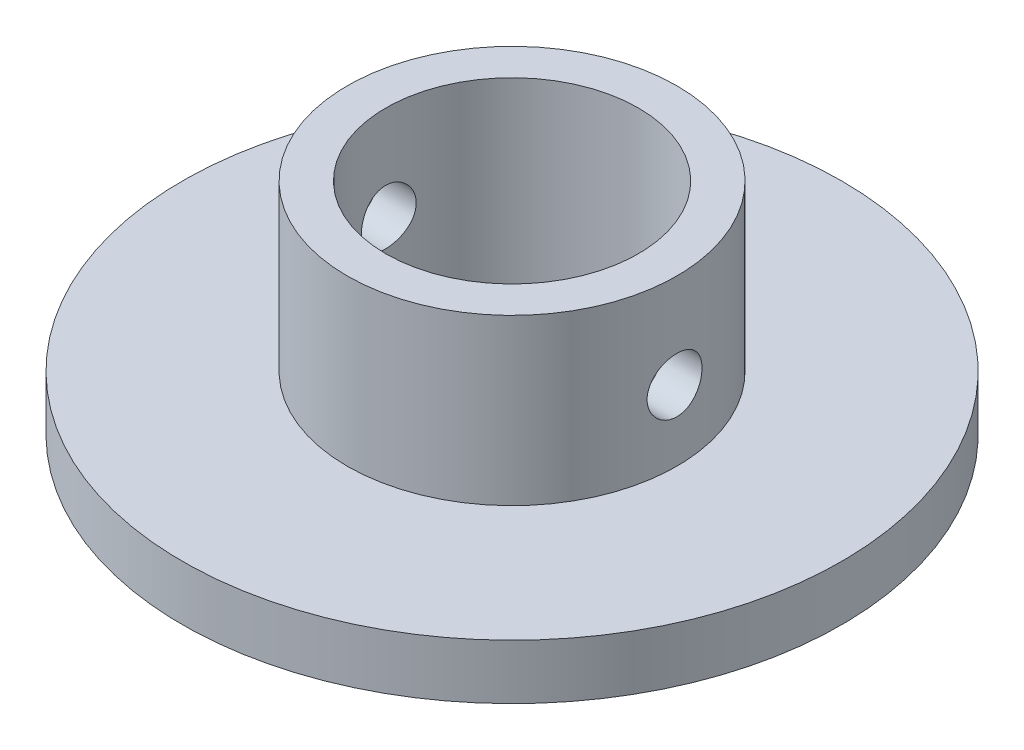
ISO-10303-21;
HEADER;
FILE_DESCRIPTION(('STEP AP214'),'2;1');
FILE_NAME('part.step','',(''),(''),'','','');
FILE_SCHEMA(('AUTOMOTIVE_DESIGN { 1 0 10303 214 1 1 1 1 }'));
ENDSEC;
DATA;
#1=APPLICATION_CONTEXT('core data for automotive mechanical design processes');
#2=APPLICATION_PROTOCOL_DEFINITION('international standard','automotive_design',2000,#1);
#3=PRODUCT_CONTEXT('',#1,'mechanical');
#4=PRODUCT('Part','Part','',(#3));
#5=PRODUCT_RELATED_PRODUCT_CATEGORY('part','',(#4));
#6=PRODUCT_DEFINITION_FORMATION('','',#4);
#7=PRODUCT_DEFINITION_CONTEXT('part definition',#1,'design');
#8=PRODUCT_DEFINITION('design','',#6,#7);
#9=PRODUCT_DEFINITION_SHAPE('','',#8);
#10=(LENGTH_UNIT() NAMED_UNIT(*) SI_UNIT(.MILLI.,.METRE.));
#11=(NAMED_UNIT(*) PLANE_ANGLE_UNIT() SI_UNIT($,.RADIAN.));
#12=(NAMED_UNIT(*) SI_UNIT($,.STERADIAN.) SOLID_ANGLE_UNIT());
#13=UNCERTAINTY_MEASURE_WITH_UNIT(LENGTH_MEASURE(1.E-05),#10,'distance_accuracy_value','');
#14=(GEOMETRIC_REPRESENTATION_CONTEXT(3) GLOBAL_UNCERTAINTY_ASSIGNED_CONTEXT((#13)) GLOBAL_UNIT_ASSIGNED_CONTEXT((#10,
#11,#12)) REPRESENTATION_CONTEXT('',''));
#15=CARTESIAN_POINT('',(0.,0.,0.));
#16=DIRECTION('',(0.,0.,1.));
#17=DIRECTION('',(1.,0.,0.));
#18=AXIS2_PLACEMENT_3D('',#15,#16,#17);
#19=CARTESIAN_POINT('',(-2.240463819,2.28,0.));
#20=DIRECTION('',(-1.,0.,0.));
#21=DIRECTION('',(0.,-1.,0.));
#22=AXIS2_PLACEMENT_3D('',#19,#20,#21);
#23=CYLINDRICAL_SURFACE('',#22,0.5);
#24=CARTESIAN_POINT('',(-2.95803989159308,2.28000000058204,0.500000000051196));
#25=CARTESIAN_POINT('',(-2.95804069507885,2.307856805182,0.499997887581498));
#26=CARTESIAN_POINT('',(-2.95843781465187,2.3357336896618,0.49766339055465));
#27=CARTESIAN_POINT('',(-2.95998356153414,2.39073428307943,0.488383475383723));
#28=CARTESIAN_POINT('',(-2.96113371597554,2.4178563444864,0.481428687005735));
#29=CARTESIAN_POINT('',(-2.96405142810723,2.47050168025128,0.463124651698856));
#30=CARTESIAN_POINT('',(-2.96581820613379,2.49602692579895,0.4517809521865));
#31=CARTESIAN_POINT('',(-2.96976910315052,2.54480225948373,0.425033335167014));
#32=CARTESIAN_POINT('',(-2.97195306733915,2.56805318670806,0.409630922888113));
#33=CARTESIAN_POINT('',(-2.97651688433684,2.61186198285905,0.375037951768843));
#34=CARTESIAN_POINT('',(-2.97889831174944,2.63239395897036,0.355814804728234));
#35=CARTESIAN_POINT('',(-2.98357484216161,2.66995778425966,0.31419556037142));
#36=CARTESIAN_POINT('',(-2.98586993556238,2.68698924517748,0.29179911155289));
#37=CARTESIAN_POINT('',(-2.99013148346955,2.71716297888047,0.244304469110437));
#38=CARTESIAN_POINT('',(-2.99209590196663,2.73028151544495,0.219190997402315));
#39=CARTESIAN_POINT('',(-2.99545748606508,2.75210429010311,0.167078889780056));
#40=CARTESIAN_POINT('',(-2.99685469345198,2.76080885337897,0.140080392904535));
#41=CARTESIAN_POINT('',(-2.99891346860788,2.77347850175433,0.0852287675154882));
#42=CARTESIAN_POINT('',(-2.99958170512892,2.77748657667637,0.0573858231972914));
#43=CARTESIAN_POINT('',(-3.00013015887605,2.78078315193157,0.00141510331579962));
#44=CARTESIAN_POINT('',(-3.00001042835627,2.78007196522308,-0.0267126532366269));
#45=CARTESIAN_POINT('',(-2.99900171889423,2.77398374229923,-0.082160324865193));
#46=CARTESIAN_POINT('',(-2.998120374546,2.76865301197167,-0.109485483141747));
#47=CARTESIAN_POINT('',(-2.99569597020577,2.75354986398974,-0.162848182602397));
#48=CARTESIAN_POINT('',(-2.99415288465514,2.74377727477528,-0.188885674009228));
#49=CARTESIAN_POINT('',(-2.99056532729767,2.72002141607699,-0.239072201547559));
#50=CARTESIAN_POINT('',(-2.9885185754237,2.70601893060872,-0.263211972124426));
#51=CARTESIAN_POINT('',(-2.98415129727813,2.67421604048092,-0.308814768686282));
#52=CARTESIAN_POINT('',(-2.98183076995704,2.65641562126216,-0.330277784409536));
#53=CARTESIAN_POINT('',(-2.97714105304146,2.61726863720083,-0.370189837180317));
#54=CARTESIAN_POINT('',(-2.97477161330008,2.59588224237293,-0.388599797307925));
#55=CARTESIAN_POINT('',(-2.9702768691655,2.55029303682724,-0.421584466963118));
#56=CARTESIAN_POINT('',(-2.96815167487368,2.52608896577142,-0.436157450643181));
#57=CARTESIAN_POINT('',(-2.96438554906937,2.47549671641633,-0.461061636009483));
#58=CARTESIAN_POINT('',(-2.96274555482401,2.44910443535074,-0.47138464282226));
#59=CARTESIAN_POINT('',(-2.96015056134997,2.39497021229259,-0.48741752826706));
#60=CARTESIAN_POINT('',(-2.95919411555658,2.36723125396264,-0.493137152101977));
#61=CARTESIAN_POINT('',(-2.95823880374551,2.31957334005354,-0.498825652147997));
#62=CARTESIAN_POINT('',(-2.95803932070178,2.29979173839721,-0.500001500823426));
#63=CARTESIAN_POINT('',(-2.95804069501651,2.25214319614594,-0.499997887596045));
#64=CARTESIAN_POINT('',(-2.95843781461349,2.22426631166143,-0.497663390686697));
#65=CARTESIAN_POINT('',(-2.95998356149858,2.16926571822704,-0.488383475695662));
#66=CARTESIAN_POINT('',(-2.96113371591869,2.14214365680794,-0.481428687380342));
#67=CARTESIAN_POINT('',(-2.9640514280229,2.08949832100205,-0.463124652209911));
#68=CARTESIAN_POINT('',(-2.96581820604334,2.06397307542571,-0.451780952770772));
#69=CARTESIAN_POINT('',(-2.96976910304825,2.01519774167049,-0.425033335887275));
#70=CARTESIAN_POINT('',(-2.97195306723123,1.99194681440458,-0.409630923670809));
#71=CARTESIAN_POINT('',(-2.97651688422245,1.94813801816155,-0.375037952671464));
#72=CARTESIAN_POINT('',(-2.97889831163429,1.92760604199951,-0.355814805688501));
#73=CARTESIAN_POINT('',(-2.98357484204891,1.89004221660052,-0.3141955614388));
#74=CARTESIAN_POINT('',(-2.98586993545289,1.8730107556236,-0.291799112669863));
#75=CARTESIAN_POINT('',(-2.99013148337088,1.842837021792,-0.244304470313722));
#76=CARTESIAN_POINT('',(-2.99209590187556,1.82971848515849,-0.219190998641915));
#77=CARTESIAN_POINT('',(-2.99545748599233,1.80789571035685,-0.167078891079758));
#78=CARTESIAN_POINT('',(-2.99685469338996,1.79919114700659,-0.140080394227996));
#79=CARTESIAN_POINT('',(-2.99891346856923,1.78652149847962,-0.0852287688708964));
#80=CARTESIAN_POINT('',(-2.99958170510282,1.78251342348076,-0.0573858245609197));
#81=CARTESIAN_POINT('',(-3.00013015887539,1.77921684807213,-0.00141510468260699));
#82=CARTESIAN_POINT('',(-3.0000104283685,1.779928034704,0.0267126518748589));
#83=CARTESIAN_POINT('',(-2.99900171893105,1.78601625747769,0.0821603235243223));
#84=CARTESIAN_POINT('',(-2.99812037459459,1.79134698773135,0.109485481816645));
#85=CARTESIAN_POINT('',(-2.99569597027563,1.80645013556942,0.162848181320672));
#86=CARTESIAN_POINT('',(-2.99415288473452,1.81622272471389,0.188885672755123));
#87=CARTESIAN_POINT('',(-2.99056532739314,1.83997858327606,0.239072200356543));
#88=CARTESIAN_POINT('',(-2.98851857552578,1.85398106867769,0.263211970969197));
#89=CARTESIAN_POINT('',(-2.98415129738941,1.88578395867904,0.308814767613738));
#90=CARTESIAN_POINT('',(-2.9818307700709,1.9035843778381,0.330277783383819));
#91=CARTESIAN_POINT('',(-2.97714105315644,1.94273136178826,0.370189836259329));
#92=CARTESIAN_POINT('',(-2.97477161341356,1.96411775656494,0.388599796444819));
#93=CARTESIAN_POINT('',(-2.97027686927076,2.00970696201643,0.421584466221142));
#94=CARTESIAN_POINT('',(-2.96815167497222,2.03391103302908,0.436157449964734));
#95=CARTESIAN_POINT('',(-2.96438554915481,2.08450328231153,0.461061635471456));
#96=CARTESIAN_POINT('',(-2.96274555490311,2.11089556334788,0.471384642360721));
#97=CARTESIAN_POINT('',(-2.96015056139773,2.16502978636375,0.487417527944937));
#98=CARTESIAN_POINT('',(-2.95919411557948,2.19276874468084,0.493137151842151));
#99=CARTESIAN_POINT('',(-2.958238803758,2.24042665947064,0.498825652160067));
#100=CARTESIAN_POINT('',(-2.95803932073147,2.26020826202865,0.500001500921398));
#101=CARTESIAN_POINT('',(-2.95803989159308,2.28000000058204,0.500000000051196));
#102=B_SPLINE_CURVE_WITH_KNOTS('',3,(#24,#25,#26,#27,#28,#29,#30,#31,#32,#33,#34,#35,#36,#37,
#38,#39,#40,#41,#42,#43,#44,#45,#46,#47,#48,#49,#50,#51,#52,#53,#54,#55,#56,#57,#58,#59,#60,#61,
#62,#63,#64,#65,#66,#67,#68,#69,#70,#71,#72,#73,#74,#75,#76,#77,#78,#79,#80,#81,#82,#83,#84,#85,
#86,#87,#88,#89,#90,#91,#92,#93,#94,#95,#96,#97,#98,#99,#100,#101),.UNSPECIFIED.,.T.,.F.,(4,2,2,
2,2,2,2,2,2,2,2,2,2,2,2,2,2,2,2,2,2,2,2,2,2,2,2,2,2,2,2,2,2,2,2,2,2,2,4),(0.,0.0835058152179128,
0.167181504466604,0.250751774535258,0.33429109495823,0.418576143657952,0.50287053580739,
0.587666327042206,0.672455870371298,0.756463065353911,0.840464689445984,0.923633902767314,
1.006806328647,1.09036243043716,1.17391885254209,1.25847365312448,1.34306642119494,
1.42782154695663,1.51239677359162,1.57172609047435,1.65523190567998,1.7389075949093,
1.82247786496903,1.9060171853901,1.990302234083,2.07459662622224,2.15939241745806,
2.24418196078943,2.32818915578128,2.41219077988235,2.49535999320644,2.5785324190882,
2.66208852086949,2.74564494296781,2.83019974354696,2.91479251160806,2.9995476373688,
3.08412286401508,3.14345218359121),.UNSPECIFIED.);
#103=CARTESIAN_POINT('',(-2.95803989159308,2.28000000058204,0.500000000051196));
#104=VERTEX_POINT('',#103);
#105=EDGE_CURVE('E58',#104,#104,#102,.T.);
#106=ORIENTED_EDGE('',*,*,#105,.T.);
#107=EDGE_LOOP('',(#106));
#108=FACE_BOUND('',#107,.T.);
#109=CARTESIAN_POINT('',(-2.24499443198505,2.27999999995898,-0.499999999901078));
#110=CARTESIAN_POINT('',(-2.24499535384733,2.25229292529622,-0.499998122074962));
#111=CARTESIAN_POINT('',(-2.24551313376967,2.22456966961218,-0.497688449759573));
#112=CARTESIAN_POINT('',(-2.24752673327762,2.16987899845851,-0.488512728170176));
#113=CARTESIAN_POINT('',(-2.24902446512596,2.14291316854075,-0.481637769877275));
#114=CARTESIAN_POINT('',(-2.25282014468306,2.09058278628752,-0.463558035764063));
#115=CARTESIAN_POINT('',(-2.25511683954123,2.06521579994516,-0.452360035887732));
#116=CARTESIAN_POINT('',(-2.260250072117,2.01672735585838,-0.425968862428391));
#117=CARTESIAN_POINT('',(-2.26308644711179,1.99360522441743,-0.410776892570007));
#118=CARTESIAN_POINT('',(-2.26903314487576,1.94986568156982,-0.376555341819291));
#119=CARTESIAN_POINT('',(-2.27214695783686,1.92929136865721,-0.357471271494804));
#120=CARTESIAN_POINT('',(-2.27826724915239,1.89160819503957,-0.316123966821642));
#121=CARTESIAN_POINT('',(-2.28127371341154,1.87449978805275,-0.293860316887014));
#122=CARTESIAN_POINT('',(-2.28687800575031,1.84406681111796,-0.246500592602825));
#123=CARTESIAN_POINT('',(-2.28947127908026,1.83078326562461,-0.221377570953132));
#124=CARTESIAN_POINT('',(-2.29391794059636,1.8086425989987,-0.169190299374774));
#125=CARTESIAN_POINT('',(-2.29577141688059,1.79978495078034,-0.142126281041101));
#126=CARTESIAN_POINT('',(-2.29850520118494,1.7868817844844,-0.0872697721177148));
#127=CARTESIAN_POINT('',(-2.29940013220665,1.78276388477565,-0.0594950479268212));
#128=CARTESIAN_POINT('',(-2.30016664455472,1.77923083776547,-0.00363550097204536));
#129=CARTESIAN_POINT('',(-2.30003834008788,1.77981516563252,0.0244492868351708));
#130=CARTESIAN_POINT('',(-2.29878402664363,1.78561599576177,0.0796326060873317));
#131=CARTESIAN_POINT('',(-2.29767482955103,1.79075444648173,0.106739780588338));
#132=CARTESIAN_POINT('',(-2.29460249194418,1.80539338777341,0.159697834251257));
#133=CARTESIAN_POINT('',(-2.29263930699969,1.81489410530128,0.185548647970951));
#134=CARTESIAN_POINT('',(-2.28805242610853,1.83805752089455,0.235477822361932));
#135=CARTESIAN_POINT('',(-2.28542402748968,1.85175000318007,0.25954191565146));
#136=CARTESIAN_POINT('',(-2.27979528865967,1.88288498417118,0.305057584807457));
#137=CARTESIAN_POINT('',(-2.27679492480684,1.90032772129031,0.326508994442888));
#138=CARTESIAN_POINT('',(-2.2706798439482,1.93889014194787,0.366652908743001));
#139=CARTESIAN_POINT('',(-2.2675640426186,1.96007752032038,0.385280273025199));
#140=CARTESIAN_POINT('',(-2.26162524737695,2.00531704438913,0.418737373770917));
#141=CARTESIAN_POINT('',(-2.25880238365863,2.02937045375376,0.433565425925742));
#142=CARTESIAN_POINT('',(-2.25376571167947,2.07977389307906,0.45903145514923));
#143=CARTESIAN_POINT('',(-2.25155417826524,2.10613203302417,0.469653844056162));
#144=CARTESIAN_POINT('',(-2.24802319536502,2.16027549178432,0.486276836990657));
#145=CARTESIAN_POINT('',(-2.24670186698705,2.18805767067651,0.492287179087443));
#146=CARTESIAN_POINT('',(-2.24529987814342,2.23731136809398,0.498632719789108));
#147=CARTESIAN_POINT('',(-2.24499372173583,2.25865088058231,0.500001446910087));
#148=CARTESIAN_POINT('',(-2.24499535393512,2.30770707465454,0.499998122187395));
#149=CARTESIAN_POINT('',(-2.24551313379201,2.33543033033233,0.497688449795089));
#150=CARTESIAN_POINT('',(-2.24752673325107,2.39012100148426,0.488512728153526));
#151=CARTESIAN_POINT('',(-2.24902446511635,2.41708683140633,0.481637769884527));
#152=CARTESIAN_POINT('',(-2.2528201446856,2.46941721366801,0.463558035790438));
#153=CARTESIAN_POINT('',(-2.25511683953903,2.49478420001447,0.452360035909264));
#154=CARTESIAN_POINT('',(-2.26025007211108,2.54327264410535,0.425968862448574));
#155=CARTESIAN_POINT('',(-2.26308644710679,2.56639477554671,0.410776892594352));
#156=CARTESIAN_POINT('',(-2.26903314487118,2.61013431839553,0.376555341850176));
#157=CARTESIAN_POINT('',(-2.27214695783175,2.63070863130896,0.35747127152805));
#158=CARTESIAN_POINT('',(-2.27826724914712,2.66839180493036,0.316123966858502));
#159=CARTESIAN_POINT('',(-2.28127371340661,2.68550021191984,0.293860316924881));
#160=CARTESIAN_POINT('',(-2.28687800574607,2.71593318885966,0.246500592642484));
#161=CARTESIAN_POINT('',(-2.28947127907635,2.72921673435547,0.221377570993616));
#162=CARTESIAN_POINT('',(-2.2939179405932,2.75135740098604,0.169190299417216));
#163=CARTESIAN_POINT('',(-2.29577141687788,2.76021504920673,0.142126281084729));
#164=CARTESIAN_POINT('',(-2.29850520118322,2.77311821550762,0.0872697721628245));
#165=CARTESIAN_POINT('',(-2.29940013220547,2.77723611521893,0.0594950479722153));
#166=CARTESIAN_POINT('',(-2.30016664455465,2.78076916223421,0.00363550101743227));
#167=CARTESIAN_POINT('',(-2.30003834008837,2.7801848343697,-0.0244492867900768));
#168=CARTESIAN_POINT('',(-2.29878402664517,2.77438400424538,-0.0796326060428936));
#169=CARTESIAN_POINT('',(-2.29767482955308,2.76924555352788,-0.106739780544262));
#170=CARTESIAN_POINT('',(-2.29460249194716,2.75460661224094,-0.159697834208651));
#171=CARTESIAN_POINT('',(-2.29263930700307,2.74510589471531,-0.185548647929437));
#172=CARTESIAN_POINT('',(-2.28805242611253,2.72194247912616,-0.235477822323103));
#173=CARTESIAN_POINT('',(-2.28542402749389,2.70824999684251,-0.25954191561421));
#174=CARTESIAN_POINT('',(-2.27979528866437,2.67711501585545,-0.305057584772783));
#175=CARTESIAN_POINT('',(-2.27679492481184,2.65967227873866,-0.326508994409323));
#176=CARTESIAN_POINT('',(-2.27067984395322,2.62110985808634,-0.366652908710855));
#177=CARTESIAN_POINT('',(-2.26756404262332,2.59992247971683,-0.385280272993463));
#178=CARTESIAN_POINT('',(-2.26162524738247,2.55468295565171,-0.418737373744926));
#179=CARTESIAN_POINT('',(-2.25880238366527,2.5306295462874,-0.43356542590468));
#180=CARTESIAN_POINT('',(-2.25376571168092,2.48022610696082,-0.459031455129345));
#181=CARTESIAN_POINT('',(-2.25155417826037,2.45386796701402,-0.469653844032322));
#182=CARTESIAN_POINT('',(-2.24802319537497,2.39972450825571,-0.486276836990454));
#183=CARTESIAN_POINT('',(-2.24670186701795,2.3719423293673,-0.492287179115549));
#184=CARTESIAN_POINT('',(-2.24529987812156,2.32268863192308,-0.498632719761482));
#185=CARTESIAN_POINT('',(-2.24499372166293,2.30134911940478,-0.500001446821568));
#186=CARTESIAN_POINT('',(-2.24499443198505,2.27999999995898,-0.499999999901078));
#187=B_SPLINE_CURVE_WITH_KNOTS('',3,(#109,#110,#111,#112,#113,#114,#115,#116,#117,#118,#119,
#120,#121,#122,#123,#124,#125,#126,#127,#128,#129,#130,#131,#132,#133,#134,#135,#136,#137,#138,
#139,#140,#141,#142,#143,#144,#145,#146,#147,#148,#149,#150,#151,#152,#153,#154,#155,#156,#157,
#158,#159,#160,#161,#162,#163,#164,#165,#166,#167,#168,#169,#170,#171,#172,#173,#174,#175,#176,
#177,#178,#179,#180,#181,#182,#183,#184,#185,#186),.UNSPECIFIED.,.T.,.F.,(4,2,2,2,2,2,2,2,2,2,2,
2,2,2,2,2,2,2,2,2,2,2,2,2,2,2,2,2,2,2,2,2,2,2,2,2,2,2,4),(0.,0.0830496828803049,
0.166261912890418,0.249344241983804,0.332401559916516,0.416713176746301,0.501035823602085,
0.58623180172581,0.671417631331125,0.75528455117382,0.839142110475678,0.921589671356532,
1.00404152223212,1.08709338743263,1.17015053402024,1.25490048072607,1.33968793397242,
1.42478677153193,1.50970542962325,1.57369766334073,1.65674734621028,1.73995957622876,
1.8230419053326,1.90609922326183,1.99041084008781,2.07473348694634,2.15992946507132,
2.24511529467556,2.32898221451857,2.41283977382113,2.49528733470163,2.57773918557785,
2.66079105077972,2.74384819736514,2.82859814406606,2.91338559731657,2.99848443488365,
3.08340309296795,3.14739532676844),.UNSPECIFIED.);
#188=CARTESIAN_POINT('',(-2.24499443198505,2.27999999995898,-0.499999999901078));
#189=VERTEX_POINT('',#188);
#190=EDGE_CURVE('E50',#189,#189,#187,.T.);
#191=ORIENTED_EDGE('',*,*,#190,.F.);
#192=EDGE_LOOP('',(#191));
#193=FACE_BOUND('',#192,.T.);
#194=ADVANCED_FACE('F14',(#108,#193),#23,.F.);
#195=CARTESIAN_POINT('',(0.,1.,0.));
#196=DIRECTION('',(0.,-1.,0.));
#197=DIRECTION('',(0.,0.,-1.));
#198=AXIS2_PLACEMENT_3D('',#195,#196,#197);
#199=CYLINDRICAL_SURFACE('',#198,6.);
#200=CARTESIAN_POINT('',(0.,1.,0.));
#201=DIRECTION('',(0.,-1.,0.));
#202=DIRECTION('',(0.,0.,-1.));
#203=AXIS2_PLACEMENT_3D('',#200,#201,#202);
#204=CIRCLE('',#203,6.);
#205=CARTESIAN_POINT('',(0.,1.,-6.));
#206=VERTEX_POINT('',#205);
#207=EDGE_CURVE('E18',#206,#206,#204,.F.);
#208=ORIENTED_EDGE('',*,*,#207,.F.);
#209=EDGE_LOOP('',(#208));
#210=FACE_BOUND('',#209,.T.);
#211=CARTESIAN_POINT('',(0.,0.,0.));
#212=DIRECTION('',(0.,-1.,0.));
#213=DIRECTION('',(0.,0.,-1.));
#214=AXIS2_PLACEMENT_3D('',#211,#212,#213);
#215=CIRCLE('',#214,6.);
#216=CARTESIAN_POINT('',(0.,0.,-6.));
#217=VERTEX_POINT('',#216);
#218=EDGE_CURVE('E57',#217,#217,#215,.F.);
#219=ORIENTED_EDGE('',*,*,#218,.T.);
#220=EDGE_LOOP('',(#219));
#221=FACE_BOUND('',#220,.T.);
#222=ADVANCED_FACE('F66',(#210,#221),#199,.T.);
#223=CARTESIAN_POINT('',(-6.072,1.,-6.072));
#224=DIRECTION('',(0.,1.,0.));
#225=DIRECTION('',(0.,0.,1.));
#226=AXIS2_PLACEMENT_3D('',#223,#224,#225);
#227=PLANE('',#226);
#228=CARTESIAN_POINT('',(0.,1.,0.));
#229=DIRECTION('',(0.,-1.,0.));
#230=DIRECTION('',(0.,0.,-1.));
#231=AXIS2_PLACEMENT_3D('',#228,#229,#230);
#232=CIRCLE('',#231,3.);
#233=CARTESIAN_POINT('',(0.,1.,-3.));
#234=VERTEX_POINT('',#233);
#235=EDGE_CURVE('E103',#234,#234,#232,.T.);
#236=ORIENTED_EDGE('',*,*,#235,.T.);
#237=EDGE_LOOP('',(#236));
#238=FACE_BOUND('',#237,.T.);
#239=ORIENTED_EDGE('',*,*,#207,.T.);
#240=EDGE_LOOP('',(#239));
#241=FACE_BOUND('',#240,.T.);
#242=ADVANCED_FACE('F70',(#238,#241),#227,.T.);
#243=CARTESIAN_POINT('',(-3.036,4.,-3.036));
#244=DIRECTION('',(0.,1.,0.));
#245=DIRECTION('',(0.,0.,1.));
#246=AXIS2_PLACEMENT_3D('',#243,#244,#245);
#247=PLANE('',#246);
#248=CARTESIAN_POINT('',(0.,4.,0.));
#249=DIRECTION('',(0.,-1.,0.));
#250=DIRECTION('',(0.,0.,-1.));
#251=AXIS2_PLACEMENT_3D('',#248,#249,#250);
#252=CIRCLE('',#251,2.3);
#253=CARTESIAN_POINT('',(0.,4.,-2.3));
#254=VERTEX_POINT('',#253);
#255=EDGE_CURVE('E108',#254,#254,#252,.F.);
#256=ORIENTED_EDGE('',*,*,#255,.F.);
#257=EDGE_LOOP('',(#256));
#258=FACE_BOUND('',#257,.T.);
#259=CARTESIAN_POINT('',(0.,4.,0.));
#260=DIRECTION('',(0.,-1.,0.));
#261=DIRECTION('',(0.,0.,-1.));
#262=AXIS2_PLACEMENT_3D('',#259,#260,#261);
#263=CIRCLE('',#262,3.);
#264=CARTESIAN_POINT('',(0.,4.,-3.));
#265=VERTEX_POINT('',#264);
#266=EDGE_CURVE('E105',#265,#265,#263,.F.);
#267=ORIENTED_EDGE('',*,*,#266,.T.);
#268=EDGE_LOOP('',(#267));
#269=FACE_BOUND('',#268,.T.);
#270=ADVANCED_FACE('F72',(#258,#269),#247,.T.);
#271=CARTESIAN_POINT('',(-6.072,0.,-6.072));
#272=DIRECTION('',(0.,1.,0.));
#273=DIRECTION('',(0.,0.,1.));
#274=AXIS2_PLACEMENT_3D('',#271,#272,#273);
#275=PLANE('',#274);
#276=CARTESIAN_POINT('',(0.,0.,0.));
#277=DIRECTION('',(0.,-1.,0.));
#278=DIRECTION('',(0.,0.,-1.));
#279=AXIS2_PLACEMENT_3D('',#276,#277,#278);
#280=CIRCLE('',#279,2.3);
#281=CARTESIAN_POINT('',(0.,0.,-2.3));
#282=VERTEX_POINT('',#281);
#283=EDGE_CURVE('E27',#282,#282,#280,.T.);
#284=ORIENTED_EDGE('',*,*,#283,.F.);
#285=EDGE_LOOP('',(#284));
#286=FACE_BOUND('',#285,.T.);
#287=ORIENTED_EDGE('',*,*,#218,.F.);
#288=EDGE_LOOP('',(#287));
#289=FACE_BOUND('',#288,.T.);
#290=ADVANCED_FACE('F16',(#286,#289),#275,.F.);
#291=CARTESIAN_POINT('',(0.,4.,0.));
#292=DIRECTION('',(0.,-1.,0.));
#293=DIRECTION('',(0.,0.,-1.));
#294=AXIS2_PLACEMENT_3D('',#291,#292,#293);
#295=CYLINDRICAL_SURFACE('',#294,3.);
#296=ORIENTED_EDGE('',*,*,#235,.F.);
#297=EDGE_LOOP('',(#296));
#298=FACE_BOUND('',#297,.T.);
#299=ORIENTED_EDGE('',*,*,#266,.F.);
#300=EDGE_LOOP('',(#299));
#301=FACE_BOUND('',#300,.T.);
#302=CARTESIAN_POINT('',(2.95803989145929,2.27999999994612,0.499999999892895));
#303=CARTESIAN_POINT('',(2.9580406949195,2.25214319534008,0.49999788742817));
#304=CARTESIAN_POINT('',(2.95843781460076,2.22426631085064,0.497663390563089));
#305=CARTESIAN_POINT('',(2.9599835615567,2.16926571742626,0.488383475547265));
#306=CARTESIAN_POINT('',(2.96113371596295,2.14214365602187,0.481428687164034));
#307=CARTESIAN_POINT('',(2.96405142806379,2.08949832025159,0.463124651892079));
#308=CARTESIAN_POINT('',(2.96581820609468,2.06397307469612,0.451780952419325));
#309=CARTESIAN_POINT('',(2.96976910311165,2.01519774098385,0.42503333546209));
#310=CARTESIAN_POINT('',(2.97195306729632,1.99194681374048,0.409630923204665));
#311=CARTESIAN_POINT('',(2.97651688429038,1.94813801754916,0.375037952129134));
#312=CARTESIAN_POINT('',(2.97889831170334,1.92760604141635,0.355814805111017));
#313=CARTESIAN_POINT('',(2.98357484211685,1.89004221608343,0.314195560797243));
#314=CARTESIAN_POINT('',(2.98586993551863,1.87301075514302,0.291799111999684));
#315=CARTESIAN_POINT('',(2.99013148342987,1.84283702138965,0.244304469593631));
#316=CARTESIAN_POINT('',(2.99209590193,1.8297184847977,0.219190997900683));
#317=CARTESIAN_POINT('',(2.99545748603584,1.80789571008179,0.167078890302647));
#318=CARTESIAN_POINT('',(2.99685469342708,1.79919114677585,0.140080393436084));
#319=CARTESIAN_POINT('',(2.99891346859238,1.78652149833948,0.0852287680590671));
#320=CARTESIAN_POINT('',(2.99958170511845,1.78251342338661,0.0573858237439714));
#321=CARTESIAN_POINT('',(3.00013015887578,1.77921684806992,0.0014151038637536));
#322=CARTESIAN_POINT('',(3.00001042836117,1.77992803474769,-0.0267126526904955));
#323=CARTESIAN_POINT('',(2.999001718909,1.78601625761126,-0.0821603243271535));
#324=CARTESIAN_POINT('',(2.9981203745655,1.79134698790915,-0.109485482609939));
#325=CARTESIAN_POINT('',(2.99569597023381,1.80645013583333,-0.162848182088002));
#326=CARTESIAN_POINT('',(2.99415288468699,1.81622272501974,-0.18888567350601));
#327=CARTESIAN_POINT('',(2.99056532733596,1.83997858366353,-0.239072201069868));
#328=CARTESIAN_POINT('',(2.98851857546462,1.85398106910514,-0.26321197166121));
#329=CARTESIAN_POINT('',(2.98415129732276,1.88578395918226,-0.308814768256232));
#330=CARTESIAN_POINT('',(2.98183077000274,1.90358437837698,-0.330277783998177));
#331=CARTESIAN_POINT('',(2.97714105308758,1.94273136239336,-0.370189836810533));
#332=CARTESIAN_POINT('',(2.97477161334554,1.96411775720042,-0.388599796961039));
#333=CARTESIAN_POINT('',(2.97027686920791,2.00970696270824,-0.421584466665235));
#334=CARTESIAN_POINT('',(2.96815167491373,2.03391103374702,-0.43615745037142));
#335=CARTESIAN_POINT('',(2.96438554910312,2.08450328307382,-0.461061635793297));
#336=CARTESIAN_POINT('',(2.96274555485383,2.11089556412828,-0.471384642635329));
#337=CARTESIAN_POINT('',(2.96015056137093,2.16502978716938,-0.487417528140226));
#338=CARTESIAN_POINT('',(2.95919411557261,2.19276874549343,-0.493137152005896));
#339=CARTESIAN_POINT('',(2.95823880374576,2.24042665975335,-0.498825652146876));
#340=CARTESIAN_POINT('',(2.95803932069828,2.26020826176941,-0.500001500844196));
#341=CARTESIAN_POINT('',(2.95804069502143,2.3078568043844,-0.49999788756685));
#342=CARTESIAN_POINT('',(2.95843781462351,2.3357336888709,-0.497663390627375));
#343=CARTESIAN_POINT('',(2.95998356151846,2.39073428230385,-0.488383475575487));
#344=CARTESIAN_POINT('',(2.9611337159433,2.41785634371954,-0.481428687229524));
#345=CARTESIAN_POINT('',(2.96405142805582,2.47050167950874,-0.46312465199979));
#346=CARTESIAN_POINT('',(2.96581820607973,2.49602692507209,-0.45178095253272));
#347=CARTESIAN_POINT('',(2.96976910309008,2.54480225879711,-0.425033335595923));
#348=CARTESIAN_POINT('',(2.97195306727502,2.56805318604582,-0.40963092335407));
#349=CARTESIAN_POINT('',(2.97651688426864,2.61186198225149,-0.375037952306066));
#350=CARTESIAN_POINT('',(2.97889831168089,2.63239395839319,-0.355814805299682));
#351=CARTESIAN_POINT('',(2.98357484209456,2.66995778374775,-0.314195561006653));
#352=CARTESIAN_POINT('',(2.98586993549721,2.68698924470059,-0.291799112217813));
#353=CARTESIAN_POINT('',(2.99013148341078,2.71716297847997,-0.24430446982704));
#354=CARTESIAN_POINT('',(2.99209590191238,2.73028151508552,-0.219190998140656));
#355=CARTESIAN_POINT('',(2.99545748602175,2.75210428982915,-0.167078890554206));
#356=CARTESIAN_POINT('',(2.99685469341505,2.76080885314935,-0.140080393692724));
#357=CARTESIAN_POINT('',(2.99891346858487,2.77347850161505,-0.0852287683224703));
#358=CARTESIAN_POINT('',(2.99958170511338,2.77748657658284,-0.0573858240090464));
#359=CARTESIAN_POINT('',(3.00013015887566,2.78078315192936,-0.00141510412944469));
#360=CARTESIAN_POINT('',(3.00001042836355,2.78007196526649,0.0267126524258613));
#361=CARTESIAN_POINT('',(2.99900171891616,2.7739837424321,0.0821603240664312));
#362=CARTESIAN_POINT('',(2.99812037457495,2.76865301214864,0.10948548235206));
#363=CARTESIAN_POINT('',(2.99569597024741,2.75354986425247,0.162848181838579));
#364=CARTESIAN_POINT('',(2.99415288470244,2.7437772750796,0.188885673262182));
#365=CARTESIAN_POINT('',(2.99056532735444,2.72002141646183,0.239072200839169));
#366=CARTESIAN_POINT('',(2.98851857548428,2.7060189310327,0.263211971438065));
#367=CARTESIAN_POINT('',(2.9841512973443,2.67421604097995,0.308814768049128));
#368=CARTESIAN_POINT('',(2.98183077002499,2.65641562179728,0.330277783799695));
#369=CARTESIAN_POINT('',(2.97714105310988,2.61726863780442,0.370189836629953));
#370=CARTESIAN_POINT('',(2.97477161336716,2.59588224300892,0.38859979678987));
#371=CARTESIAN_POINT('',(2.97027686922942,2.55029303751986,0.421584466519912));
#372=CARTESIAN_POINT('',(2.96815167493581,2.52608896648792,0.436157450242045));
#373=CARTESIAN_POINT('',(2.96438554911669,2.47549671717037,0.461061635686851));
#374=CARTESIAN_POINT('',(2.96274555485833,2.4491044361182,0.471384642535583));
#375=CARTESIAN_POINT('',(2.96015056139048,2.39497021308585,0.487417528091303));
#376=CARTESIAN_POINT('',(2.95919411561608,2.36723125476853,0.493137152001909));
#377=CARTESIAN_POINT('',(2.95823880372072,2.31957334033544,0.498825652117176));
#378=CARTESIAN_POINT('',(2.95803932061585,2.29979173813919,0.500001500759536));
#379=CARTESIAN_POINT('',(2.95803989145929,2.27999999994612,0.499999999892895));
#380=B_SPLINE_CURVE_WITH_KNOTS('',3,(#302,#303,#304,#305,#306,#307,#308,#309,#310,#311,#312,
#313,#314,#315,#316,#317,#318,#319,#320,#321,#322,#323,#324,#325,#326,#327,#328,#329,#330,#331,
#332,#333,#334,#335,#336,#337,#338,#339,#340,#341,#342,#343,#344,#345,#346,#347,#348,#349,#350,
#351,#352,#353,#354,#355,#356,#357,#358,#359,#360,#361,#362,#363,#364,#365,#366,#367,#368,#369,
#370,#371,#372,#373,#374,#375,#376,#377,#378,#379),.UNSPECIFIED.,.T.,.F.,(4,2,2,2,2,2,2,2,2,2,2,
2,2,2,2,2,2,2,2,2,2,2,2,2,2,2,2,2,2,2,2,2,2,2,2,2,2,2,4),(0.,0.0835058152235522,
0.167181504445859,0.250751774497784,0.334291094928224,0.418576143630163,0.502870535770593,
0.587666327004012,0.672455870335817,0.756463065322725,0.840464689417816,0.923633902739966,
1.00680632862077,1.09036243040782,1.17391885250966,1.25847365308968,1.34306642115745,
1.42782154692043,1.51239677355828,1.57172609151431,1.65523190673447,1.73890759597685,
1.82247786603575,1.90601718645633,1.99030223515277,2.0745966272954,2.15939241853047,
2.24418196186126,2.32818915684974,2.4121907809468,2.49535999426883,2.5785324201507,
2.66208852193836,2.74564494403658,2.83019974461002,2.91479251268192,2.9995476384542,
3.08412286508476,3.1434521835718),.UNSPECIFIED.);
#381=CARTESIAN_POINT('',(2.95803989145929,2.27999999994612,0.499999999892895));
#382=VERTEX_POINT('',#381);
#383=EDGE_CURVE('E22',#382,#382,#380,.T.);
#384=ORIENTED_EDGE('',*,*,#383,.F.);
#385=EDGE_LOOP('',(#384));
#386=FACE_BOUND('',#385,.T.);
#387=ORIENTED_EDGE('',*,*,#105,.F.);
#388=EDGE_LOOP('',(#387));
#389=FACE_BOUND('',#388,.T.);
#390=ADVANCED_FACE('F44',(#298,#301,#386,#389),#295,.T.);
#391=CARTESIAN_POINT('',(0.,4.,0.));
#392=DIRECTION('',(0.,-1.,0.));
#393=DIRECTION('',(0.,0.,-1.));
#394=AXIS2_PLACEMENT_3D('',#391,#392,#393);
#395=CYLINDRICAL_SURFACE('',#394,2.3);
#396=ORIENTED_EDGE('',*,*,#255,.T.);
#397=EDGE_LOOP('',(#396));
#398=FACE_BOUND('',#397,.T.);
#399=ORIENTED_EDGE('',*,*,#283,.T.);
#400=EDGE_LOOP('',(#399));
#401=FACE_BOUND('',#400,.T.);
#402=CARTESIAN_POINT('',(2.24499443210287,2.2799999997949,-0.50000000004802));
#403=CARTESIAN_POINT('',(2.24499535398042,2.25229292513793,-0.499998122229372));
#404=CARTESIAN_POINT('',(2.24551313380858,2.22456966946078,-0.49768844978649));
#405=CARTESIAN_POINT('',(2.24752673324978,2.16987899830736,-0.488512728092384));
#406=CARTESIAN_POINT('',(2.2490244651261,2.14291316838325,-0.48163776982103));
#407=CARTESIAN_POINT('',(2.25282014470619,2.09058278612392,-0.463558035709369));
#408=CARTESIAN_POINT('',(2.25511683955933,2.06521579978164,-0.452360035813564));
#409=CARTESIAN_POINT('',(2.26025007213267,2.01672735570287,-0.425968862328917));
#410=CARTESIAN_POINT('',(2.26308644712994,1.99360522426926,-0.41077689246569));
#411=CARTESIAN_POINT('',(2.26903314489593,1.94986568143638,-0.376555341703108));
#412=CARTESIAN_POINT('',(2.27214695785654,1.92929136853128,-0.357471271371417));
#413=CARTESIAN_POINT('',(2.2782672491714,1.89160819492726,-0.316123966683619));
#414=CARTESIAN_POINT('',(2.28127371343034,1.87449978794696,-0.293860316741192));
#415=CARTESIAN_POINT('',(2.2868780057676,1.84406681102784,-0.246500592443577));
#416=CARTESIAN_POINT('',(2.28947127909626,1.83078326554339,-0.221377570788431));
#417=CARTESIAN_POINT('',(2.29391794060913,1.80864259893668,-0.169190299201879));
#418=CARTESIAN_POINT('',(2.29577141689148,1.79978495072842,-0.142126280865547));
#419=CARTESIAN_POINT('',(2.29850520119175,1.78688178445279,-0.087269771938827));
#420=CARTESIAN_POINT('',(2.29940013221129,1.78276388475421,-0.0594950477472365));
#421=CARTESIAN_POINT('',(2.30016664455501,1.77923083776419,-0.00363550079248612));
#422=CARTESIAN_POINT('',(2.30003834008596,1.77981516564129,0.024449287014012));
#423=CARTESIAN_POINT('',(2.29878402663752,1.78561599579013,0.0796326062633813));
#424=CARTESIAN_POINT('',(2.29767482954292,1.7907544465197,0.106739780762337));
#425=CARTESIAN_POINT('',(2.29460249193244,1.80539338783004,0.159697834419495));
#426=CARTESIAN_POINT('',(2.29263930698632,1.81489410536694,0.185548648135485));
#427=CARTESIAN_POINT('',(2.28805242609239,1.83805752097787,0.235477822518358));
#428=CARTESIAN_POINT('',(2.28542402747238,1.85175000327213,0.259541915803418));
#429=CARTESIAN_POINT('',(2.27979528864067,1.88288498427997,0.305057584949121));
#430=CARTESIAN_POINT('',(2.2767949247873,1.90032772140709,0.326508994578724));
#431=CARTESIAN_POINT('',(2.27067984392833,1.93889014207976,0.366652908865736));
#432=CARTESIAN_POINT('',(2.26756404259892,1.96007752045936,0.385280273140646));
#433=CARTESIAN_POINT('',(2.26162524735842,2.00531704454112,0.418737373870654));
#434=CARTESIAN_POINT('',(2.25880238364105,2.02937045391166,0.433565426017055));
#435=CARTESIAN_POINT('',(2.25376571166453,2.07977389324664,0.459031455222319));
#436=CARTESIAN_POINT('',(2.25155417825197,2.10613203319544,0.469653844119569));
#437=CARTESIAN_POINT('',(2.24802319535556,2.16027549196125,0.486276837034192));
#438=CARTESIAN_POINT('',(2.24670186697973,2.18805767085539,0.492287179120809));
#439=CARTESIAN_POINT('',(2.24529987814211,2.2373113681994,0.498632719794891));
#440=CARTESIAN_POINT('',(2.24499372173627,2.25865088061157,0.500001446908098));
#441=CARTESIAN_POINT('',(2.24499535393455,2.3077070746088,0.499998122189968));
#442=CARTESIAN_POINT('',(2.2455131337909,2.33543033028798,0.497688449800082));
#443=CARTESIAN_POINT('',(2.24752673324903,2.39012100144307,0.48851272816289));
#444=CARTESIAN_POINT('',(2.24902446511392,2.41708683136691,0.481637769895823));
#445=CARTESIAN_POINT('',(2.25282014468245,2.4694172136306,0.463558035805685));
#446=CARTESIAN_POINT('',(2.2551168395355,2.49478419997742,0.452360035926817));
#447=CARTESIAN_POINT('',(2.26025007210688,2.54327264406941,0.425968862470748));
#448=CARTESIAN_POINT('',(2.26308644710233,2.56639477551152,0.410776892618845));
#449=CARTESIAN_POINT('',(2.26903314486638,2.61013431836268,0.37655534187896));
#450=CARTESIAN_POINT('',(2.2721469578269,2.63070863127767,0.357471271558737));
#451=CARTESIAN_POINT('',(2.27826724914235,2.66839180490249,0.31612396689273));
#452=CARTESIAN_POINT('',(2.28127371340198,2.68550021189384,0.293860316960743));
#453=CARTESIAN_POINT('',(2.28687800574188,2.7159331888378,0.246500592681159));
#454=CARTESIAN_POINT('',(2.28947127907249,2.72921673433584,0.221377571033448));
#455=CARTESIAN_POINT('',(2.29391794059011,2.75135740097104,0.169190299459013));
#456=CARTESIAN_POINT('',(2.29577141687523,2.76021504919412,0.142126281127337));
#457=CARTESIAN_POINT('',(2.29850520118156,2.77311821549989,0.0872697722065499));
#458=CARTESIAN_POINT('',(2.29940013220433,2.77723611521366,0.0594950480162489));
#459=CARTESIAN_POINT('',(2.30016664455458,2.78076916223391,0.00363550106146297));
#460=CARTESIAN_POINT('',(2.30003834008884,2.78018483437185,-0.0244492867463593));
#461=CARTESIAN_POINT('',(2.29878402664665,2.77438400425226,-0.0796326060003072));
#462=CARTESIAN_POINT('',(2.29767482955504,2.76924555353702,-0.106739780502485));
#463=CARTESIAN_POINT('',(2.29460249194997,2.75460661225453,-0.159697834168239));
#464=CARTESIAN_POINT('',(2.29263930700628,2.74510589473117,-0.185548647889609));
#465=CARTESIAN_POINT('',(2.28805242611655,2.72194247914684,-0.235477822284195));
#466=CARTESIAN_POINT('',(2.28542402749833,2.70824999686583,-0.259541915575696));
#467=CARTESIAN_POINT('',(2.27979528866913,2.67711501588309,-0.305057584736802));
#468=CARTESIAN_POINT('',(2.27679492481648,2.65967227876773,-0.326508994375311));
#469=CARTESIAN_POINT('',(2.27067984395804,2.62110985811692,-0.366652908682852));
#470=CARTESIAN_POINT('',(2.26756404262844,2.59992247974732,-0.385280272969361));
#471=CARTESIAN_POINT('',(2.2616252473857,2.55468295568484,-0.418737373721982));
#472=CARTESIAN_POINT('',(2.25880238366626,2.53062954632373,-0.433565425879604));
#473=CARTESIAN_POINT('',(2.25376571168799,2.48022610700506,-0.45903145511374));
#474=CARTESIAN_POINT('',(2.25155417827579,2.45386796706309,-0.469653844028554));
#475=CARTESIAN_POINT('',(2.24802319536603,2.39972450830559,-0.48627683696386));
#476=CARTESIAN_POINT('',(2.2467018669766,2.3719423294128,-0.4922871790532));
#477=CARTESIAN_POINT('',(2.24529987815295,2.32268863189713,-0.498632719807399));
#478=CARTESIAN_POINT('',(2.24499372176898,2.30134911930947,-0.500001446962761));
#479=CARTESIAN_POINT('',(2.24499443210287,2.2799999997949,-0.50000000004802));
#480=B_SPLINE_CURVE_WITH_KNOTS('',3,(#402,#403,#404,#405,#406,#407,#408,#409,#410,#411,#412,
#413,#414,#415,#416,#417,#418,#419,#420,#421,#422,#423,#424,#425,#426,#427,#428,#429,#430,#431,
#432,#433,#434,#435,#436,#437,#438,#439,#440,#441,#442,#443,#444,#445,#446,#447,#448,#449,#450,
#451,#452,#453,#454,#455,#456,#457,#458,#459,#460,#461,#462,#463,#464,#465,#466,#467,#468,#469,
#470,#471,#472,#473,#474,#475,#476,#477,#478,#479),.UNSPECIFIED.,.T.,.F.,(4,2,2,2,2,2,2,2,2,2,2,
2,2,2,2,2,2,2,2,2,2,2,2,2,2,2,2,2,2,2,2,2,2,2,2,2,2,2,4),(0.,0.0830496828751459,
0.166261912908069,0.249344242015533,0.332401559941693,0.416713176768501,0.501035823631045,
0.58623180175623,0.671417631359381,0.755284551199479,0.839142110499868,0.921589671380303,
1.00404152225518,1.08709338745734,1.17015053404665,1.25490048075392,1.33968793400176,
1.42478677156036,1.50970542965043,1.57369766314038,1.6567473460132,1.73995957603529,
1.82304190513725,1.90609922306449,1.99041083988999,2.07473348674811,2.15992946487324,
2.24511529447749,2.32898221432073,2.41283977362406,2.49528733450559,2.57773918538106,
2.66079105057984,2.74384819716753,2.8285981438749,2.91338559711824,2.99848443467451,
3.08340309277015,3.14739532678618),.UNSPECIFIED.);
#481=CARTESIAN_POINT('',(2.24499443210287,2.2799999997949,-0.50000000004802));
#482=VERTEX_POINT('',#481);
#483=EDGE_CURVE('E10',#482,#482,#480,.T.);
#484=ORIENTED_EDGE('',*,*,#483,.F.);
#485=EDGE_LOOP('',(#484));
#486=FACE_BOUND('',#485,.T.);
#487=ORIENTED_EDGE('',*,*,#190,.T.);
#488=EDGE_LOOP('',(#487));
#489=FACE_BOUND('',#488,.T.);
#490=ADVANCED_FACE('F41',(#398,#401,#486,#489),#395,.F.);
#491=CARTESIAN_POINT('',(3.00453297330021,2.28,0.));
#492=DIRECTION('',(-1.,0.,0.));
#493=DIRECTION('',(0.,-1.,0.));
#494=AXIS2_PLACEMENT_3D('',#491,#492,#493);
#495=CYLINDRICAL_SURFACE('',#494,0.5);
#496=ORIENTED_EDGE('',*,*,#483,.T.);
#497=EDGE_LOOP('',(#496));
#498=FACE_BOUND('',#497,.T.);
#499=ORIENTED_EDGE('',*,*,#383,.T.);
#500=EDGE_LOOP('',(#499));
#501=FACE_BOUND('',#500,.T.);
#502=ADVANCED_FACE('F39',(#498,#501),#495,.F.);
#503=CLOSED_SHELL('',(#194,#222,#242,#270,#290,#390,#490,#502));
#504=MANIFOLD_SOLID_BREP('B1',#503);
#505=ADVANCED_BREP_SHAPE_REPRESENTATION('',(#18,#504),#14);
#506=SHAPE_DEFINITION_REPRESENTATION(#9,#505);
ENDSEC;
END-ISO-10303-21;
